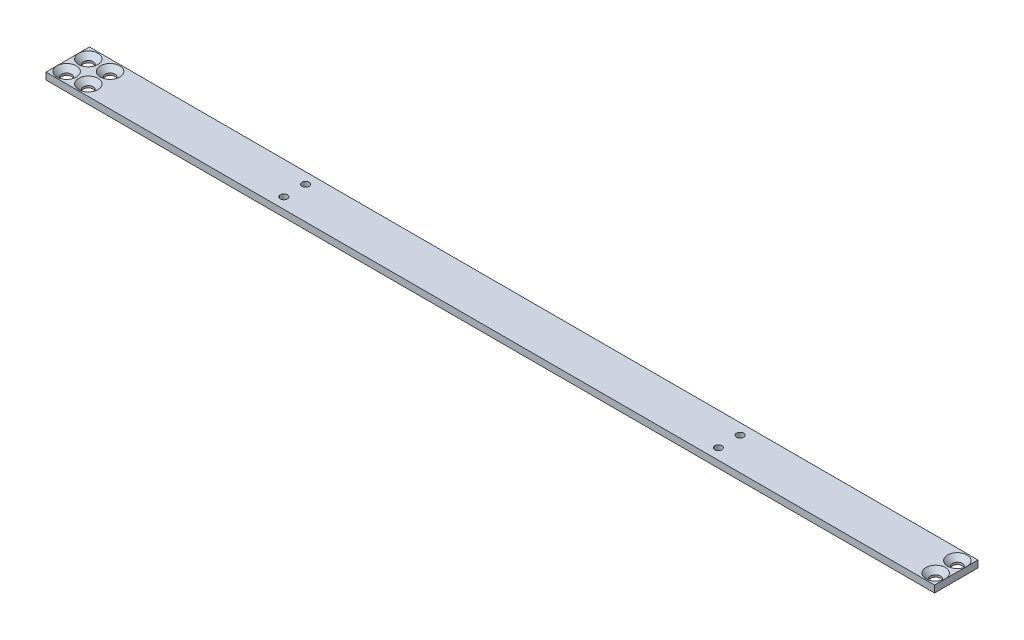
ISO-10303-21;
HEADER;
FILE_DESCRIPTION(('STEP AP214'),'2;1');
FILE_NAME('part.step','',(''),(''),'','','');
FILE_SCHEMA(('AUTOMOTIVE_DESIGN { 1 0 10303 214 1 1 1 1 }'));
ENDSEC;
DATA;
#1=APPLICATION_CONTEXT('core data for automotive mechanical design processes');
#2=APPLICATION_PROTOCOL_DEFINITION('international standard','automotive_design',2000,#1);
#3=PRODUCT_CONTEXT('',#1,'mechanical');
#4=PRODUCT('Part','Part','',(#3));
#5=PRODUCT_RELATED_PRODUCT_CATEGORY('part','',(#4));
#6=PRODUCT_DEFINITION_FORMATION('','',#4);
#7=PRODUCT_DEFINITION_CONTEXT('part definition',#1,'design');
#8=PRODUCT_DEFINITION('design','',#6,#7);
#9=PRODUCT_DEFINITION_SHAPE('','',#8);
#10=(LENGTH_UNIT() NAMED_UNIT(*) SI_UNIT(.MILLI.,.METRE.));
#11=(NAMED_UNIT(*) PLANE_ANGLE_UNIT() SI_UNIT($,.RADIAN.));
#12=(NAMED_UNIT(*) SI_UNIT($,.STERADIAN.) SOLID_ANGLE_UNIT());
#13=UNCERTAINTY_MEASURE_WITH_UNIT(LENGTH_MEASURE(1.E-05),#10,'distance_accuracy_value','');
#14=(GEOMETRIC_REPRESENTATION_CONTEXT(3) GLOBAL_UNCERTAINTY_ASSIGNED_CONTEXT((#13)) GLOBAL_UNIT_ASSIGNED_CONTEXT((#10,
#11,#12)) REPRESENTATION_CONTEXT('',''));
#15=CARTESIAN_POINT('',(0.,0.,0.));
#16=DIRECTION('',(0.,0.,1.));
#17=DIRECTION('',(1.,0.,0.));
#18=AXIS2_PLACEMENT_3D('',#15,#16,#17);
#19=CARTESIAN_POINT('',(0.,0.,0.));
#20=DIRECTION('',(0.,-1.,0.));
#21=DIRECTION('',(0.,0.,-1.));
#22=AXIS2_PLACEMENT_3D('',#19,#20,#21);
#23=PLANE('',#22);
#24=CARTESIAN_POINT('',(100.,0.,-5.00000000000001));
#25=DIRECTION('',(0.,1.,0.));
#26=DIRECTION('',(0.,0.,1.));
#27=AXIS2_PLACEMENT_3D('',#24,#25,#26);
#28=CIRCLE('',#27,1.65);
#29=CARTESIAN_POINT('',(100.,0.,-3.35000000000001));
#30=VERTEX_POINT('',#29);
#31=EDGE_CURVE('E229',#30,#30,#28,.T.);
#32=ORIENTED_EDGE('',*,*,#31,.T.);
#33=EDGE_LOOP('',(#32));
#34=FACE_BOUND('',#33,.T.);
#35=CARTESIAN_POINT('',(-100.,0.,4.99999999999999));
#36=DIRECTION('',(0.,1.,0.));
#37=DIRECTION('',(0.,0.,1.));
#38=AXIS2_PLACEMENT_3D('',#35,#36,#37);
#39=CIRCLE('',#38,1.65);
#40=CARTESIAN_POINT('',(-100.,0.,6.64999999999999));
#41=VERTEX_POINT('',#40);
#42=EDGE_CURVE('E221',#41,#41,#39,.T.);
#43=ORIENTED_EDGE('',*,*,#42,.T.);
#44=EDGE_LOOP('',(#43));
#45=FACE_BOUND('',#44,.T.);
#46=CARTESIAN_POINT('',(-100.,0.,-5.00000000000001));
#47=DIRECTION('',(0.,1.,0.));
#48=DIRECTION('',(0.,0.,1.));
#49=AXIS2_PLACEMENT_3D('',#46,#47,#48);
#50=CIRCLE('',#49,1.65);
#51=CARTESIAN_POINT('',(-100.,0.,-3.35000000000001));
#52=VERTEX_POINT('',#51);
#53=EDGE_CURVE('E213',#52,#52,#50,.T.);
#54=ORIENTED_EDGE('',*,*,#53,.T.);
#55=EDGE_LOOP('',(#54));
#56=FACE_BOUND('',#55,.T.);
#57=CARTESIAN_POINT('',(100.,0.,4.99999999999999));
#58=DIRECTION('',(0.,1.,0.));
#59=DIRECTION('',(0.,0.,1.));
#60=AXIS2_PLACEMENT_3D('',#57,#58,#59);
#61=CIRCLE('',#60,1.65);
#62=CARTESIAN_POINT('',(100.,0.,6.64999999999999));
#63=VERTEX_POINT('',#62);
#64=EDGE_CURVE('E205',#63,#63,#61,.T.);
#65=ORIENTED_EDGE('',*,*,#64,.T.);
#66=EDGE_LOOP('',(#65));
#67=FACE_BOUND('',#66,.T.);
#68=CARTESIAN_POINT('',(-200.,0.,-5.));
#69=DIRECTION('',(0.,1.,0.));
#70=DIRECTION('',(0.,0.,1.));
#71=AXIS2_PLACEMENT_3D('',#68,#69,#70);
#72=CIRCLE('',#71,2.25);
#73=CARTESIAN_POINT('',(-200.,0.,-2.75));
#74=VERTEX_POINT('',#73);
#75=EDGE_CURVE('E169',#74,#74,#72,.T.);
#76=ORIENTED_EDGE('',*,*,#75,.T.);
#77=EDGE_LOOP('',(#76));
#78=FACE_BOUND('',#77,.T.);
#79=CARTESIAN_POINT('',(-190.,0.,5.));
#80=DIRECTION('',(0.,1.,0.));
#81=DIRECTION('',(0.,0.,1.));
#82=AXIS2_PLACEMENT_3D('',#79,#80,#81);
#83=CIRCLE('',#82,2.25);
#84=CARTESIAN_POINT('',(-190.,0.,7.25000000000001));
#85=VERTEX_POINT('',#84);
#86=EDGE_CURVE('E157',#85,#85,#83,.T.);
#87=ORIENTED_EDGE('',*,*,#86,.T.);
#88=EDGE_LOOP('',(#87));
#89=FACE_BOUND('',#88,.T.);
#90=CARTESIAN_POINT('',(200.,0.,-5.));
#91=DIRECTION('',(0.,1.,0.));
#92=DIRECTION('',(0.,0.,1.));
#93=AXIS2_PLACEMENT_3D('',#90,#91,#92);
#94=CIRCLE('',#93,2.25);
#95=CARTESIAN_POINT('',(200.,0.,-2.75));
#96=VERTEX_POINT('',#95);
#97=EDGE_CURVE('E145',#96,#96,#94,.T.);
#98=ORIENTED_EDGE('',*,*,#97,.T.);
#99=EDGE_LOOP('',(#98));
#100=FACE_BOUND('',#99,.T.);
#101=CARTESIAN_POINT('',(200.,0.,5.));
#102=DIRECTION('',(0.,1.,0.));
#103=DIRECTION('',(0.,0.,1.));
#104=AXIS2_PLACEMENT_3D('',#101,#102,#103);
#105=CIRCLE('',#104,2.25);
#106=CARTESIAN_POINT('',(200.,0.,7.25));
#107=VERTEX_POINT('',#106);
#108=EDGE_CURVE('E117',#107,#107,#105,.T.);
#109=ORIENTED_EDGE('',*,*,#108,.T.);
#110=EDGE_LOOP('',(#109));
#111=FACE_BOUND('',#110,.T.);
#112=DIRECTION('',(0.,0.,-1.));
#113=VECTOR('',#112,1.);
#114=CARTESIAN_POINT('',(204.5,0.,9.99999999999999));
#115=LINE('',#114,#113);
#116=CARTESIAN_POINT('',(204.5,0.,9.99999999999999));
#117=VERTEX_POINT('',#116);
#118=CARTESIAN_POINT('',(204.5,0.,-10.));
#119=VERTEX_POINT('',#118);
#120=EDGE_CURVE('E113',#117,#119,#115,.T.);
#121=ORIENTED_EDGE('',*,*,#120,.F.);
#122=DIRECTION('',(1.,0.,0.));
#123=VECTOR('',#122,1.);
#124=CARTESIAN_POINT('',(-204.5,0.,9.99999999999999));
#125=LINE('',#124,#123);
#126=CARTESIAN_POINT('',(-204.5,0.,9.99999999999999));
#127=VERTEX_POINT('',#126);
#128=EDGE_CURVE('E84',#127,#117,#125,.T.);
#129=ORIENTED_EDGE('',*,*,#128,.F.);
#130=DIRECTION('',(0.,0.,1.));
#131=VECTOR('',#130,1.);
#132=CARTESIAN_POINT('',(-204.5,0.,9.99999999999999));
#133=LINE('',#132,#131);
#134=CARTESIAN_POINT('',(-204.5,0.,-10.));
#135=VERTEX_POINT('',#134);
#136=EDGE_CURVE('E78',#135,#127,#133,.T.);
#137=ORIENTED_EDGE('',*,*,#136,.F.);
#138=DIRECTION('',(-1.,0.,0.));
#139=VECTOR('',#138,1.);
#140=CARTESIAN_POINT('',(-204.5,0.,-10.));
#141=LINE('',#140,#139);
#142=EDGE_CURVE('E102',#119,#135,#141,.T.);
#143=ORIENTED_EDGE('',*,*,#142,.F.);
#144=EDGE_LOOP('',(#121,#129,#137,#143));
#145=FACE_BOUND('',#144,.T.);
#146=CARTESIAN_POINT('',(-200.,0.,5.));
#147=DIRECTION('',(0.,1.,0.));
#148=DIRECTION('',(0.,0.,1.));
#149=AXIS2_PLACEMENT_3D('',#146,#147,#148);
#150=CIRCLE('',#149,2.25);
#151=CARTESIAN_POINT('',(-200.,0.,7.25000000000001));
#152=VERTEX_POINT('',#151);
#153=EDGE_CURVE('E181',#152,#152,#150,.T.);
#154=ORIENTED_EDGE('',*,*,#153,.T.);
#155=EDGE_LOOP('',(#154));
#156=FACE_BOUND('',#155,.T.);
#157=CARTESIAN_POINT('',(-190.,0.,-5.));
#158=DIRECTION('',(0.,1.,0.));
#159=DIRECTION('',(0.,0.,1.));
#160=AXIS2_PLACEMENT_3D('',#157,#158,#159);
#161=CIRCLE('',#160,2.25);
#162=CARTESIAN_POINT('',(-190.,0.,-2.75));
#163=VERTEX_POINT('',#162);
#164=EDGE_CURVE('E193',#163,#163,#161,.T.);
#165=ORIENTED_EDGE('',*,*,#164,.T.);
#166=EDGE_LOOP('',(#165));
#167=FACE_BOUND('',#166,.T.);
#168=ADVANCED_FACE('F43',(#34,#45,#56,#67,#78,#89,#100,#111,#145,#156,#167),#23,.T.);
#169=CARTESIAN_POINT('',(0.,3.175,0.));
#170=DIRECTION('',(0.,-1.,0.));
#171=DIRECTION('',(0.,0.,-1.));
#172=AXIS2_PLACEMENT_3D('',#169,#170,#171);
#173=PLANE('',#172);
#174=CARTESIAN_POINT('',(100.,3.175,-5.00000000000001));
#175=DIRECTION('',(0.,1.,0.));
#176=DIRECTION('',(0.,0.,1.));
#177=AXIS2_PLACEMENT_3D('',#174,#175,#176);
#178=CIRCLE('',#177,1.65);
#179=CARTESIAN_POINT('',(100.,3.175,-3.35000000000001));
#180=VERTEX_POINT('',#179);
#181=EDGE_CURVE('E233',#180,#180,#178,.T.);
#182=ORIENTED_EDGE('',*,*,#181,.F.);
#183=EDGE_LOOP('',(#182));
#184=FACE_BOUND('',#183,.T.);
#185=CARTESIAN_POINT('',(-100.,3.175,4.99999999999999));
#186=DIRECTION('',(0.,1.,0.));
#187=DIRECTION('',(0.,0.,1.));
#188=AXIS2_PLACEMENT_3D('',#185,#186,#187);
#189=CIRCLE('',#188,1.65);
#190=CARTESIAN_POINT('',(-100.,3.175,6.64999999999999));
#191=VERTEX_POINT('',#190);
#192=EDGE_CURVE('E225',#191,#191,#189,.T.);
#193=ORIENTED_EDGE('',*,*,#192,.F.);
#194=EDGE_LOOP('',(#193));
#195=FACE_BOUND('',#194,.T.);
#196=CARTESIAN_POINT('',(-100.,3.175,-5.00000000000001));
#197=DIRECTION('',(0.,1.,0.));
#198=DIRECTION('',(0.,0.,1.));
#199=AXIS2_PLACEMENT_3D('',#196,#197,#198);
#200=CIRCLE('',#199,1.65);
#201=CARTESIAN_POINT('',(-100.,3.175,-3.35000000000001));
#202=VERTEX_POINT('',#201);
#203=EDGE_CURVE('E217',#202,#202,#200,.T.);
#204=ORIENTED_EDGE('',*,*,#203,.F.);
#205=EDGE_LOOP('',(#204));
#206=FACE_BOUND('',#205,.T.);
#207=CARTESIAN_POINT('',(100.,3.175,4.99999999999999));
#208=DIRECTION('',(0.,1.,0.));
#209=DIRECTION('',(0.,0.,1.));
#210=AXIS2_PLACEMENT_3D('',#207,#208,#209);
#211=CIRCLE('',#210,1.65);
#212=CARTESIAN_POINT('',(100.,3.175,6.64999999999999));
#213=VERTEX_POINT('',#212);
#214=EDGE_CURVE('E209',#213,#213,#211,.T.);
#215=ORIENTED_EDGE('',*,*,#214,.F.);
#216=EDGE_LOOP('',(#215));
#217=FACE_BOUND('',#216,.T.);
#218=CARTESIAN_POINT('',(-190.,3.175,-5.));
#219=DIRECTION('',(0.,1.,0.));
#220=DIRECTION('',(0.,0.,1.));
#221=AXIS2_PLACEMENT_3D('',#218,#219,#220);
#222=CIRCLE('',#221,4.48000000000001);
#223=CARTESIAN_POINT('',(-190.,3.175,-0.519999999999993));
#224=VERTEX_POINT('',#223);
#225=EDGE_CURVE('E201',#224,#224,#222,.T.);
#226=ORIENTED_EDGE('',*,*,#225,.F.);
#227=EDGE_LOOP('',(#226));
#228=FACE_BOUND('',#227,.T.);
#229=CARTESIAN_POINT('',(-200.,3.175,5.));
#230=DIRECTION('',(0.,1.,0.));
#231=DIRECTION('',(0.,0.,1.));
#232=AXIS2_PLACEMENT_3D('',#229,#230,#231);
#233=CIRCLE('',#232,4.48000000000001);
#234=CARTESIAN_POINT('',(-200.,3.175,9.48000000000002));
#235=VERTEX_POINT('',#234);
#236=EDGE_CURVE('E189',#235,#235,#233,.T.);
#237=ORIENTED_EDGE('',*,*,#236,.F.);
#238=EDGE_LOOP('',(#237));
#239=FACE_BOUND('',#238,.T.);
#240=CARTESIAN_POINT('',(-200.,3.175,-5.));
#241=DIRECTION('',(0.,1.,0.));
#242=DIRECTION('',(0.,0.,1.));
#243=AXIS2_PLACEMENT_3D('',#240,#241,#242);
#244=CIRCLE('',#243,4.48000000000001);
#245=CARTESIAN_POINT('',(-200.,3.175,-0.519999999999993));
#246=VERTEX_POINT('',#245);
#247=EDGE_CURVE('E177',#246,#246,#244,.T.);
#248=ORIENTED_EDGE('',*,*,#247,.F.);
#249=EDGE_LOOP('',(#248));
#250=FACE_BOUND('',#249,.T.);
#251=CARTESIAN_POINT('',(-190.,3.175,5.));
#252=DIRECTION('',(0.,1.,0.));
#253=DIRECTION('',(0.,0.,1.));
#254=AXIS2_PLACEMENT_3D('',#251,#252,#253);
#255=CIRCLE('',#254,4.48000000000001);
#256=CARTESIAN_POINT('',(-190.,3.175,9.48000000000002));
#257=VERTEX_POINT('',#256);
#258=EDGE_CURVE('E165',#257,#257,#255,.T.);
#259=ORIENTED_EDGE('',*,*,#258,.F.);
#260=EDGE_LOOP('',(#259));
#261=FACE_BOUND('',#260,.T.);
#262=CARTESIAN_POINT('',(200.,3.175,5.));
#263=DIRECTION('',(0.,1.,0.));
#264=DIRECTION('',(0.,0.,1.));
#265=AXIS2_PLACEMENT_3D('',#262,#263,#264);
#266=CIRCLE('',#265,4.48000000000001);
#267=CARTESIAN_POINT('',(200.,3.175,9.48000000000001));
#268=VERTEX_POINT('',#267);
#269=EDGE_CURVE('E141',#268,#268,#266,.T.);
#270=ORIENTED_EDGE('',*,*,#269,.F.);
#271=EDGE_LOOP('',(#270));
#272=FACE_BOUND('',#271,.T.);
#273=DIRECTION('',(0.,0.,-1.));
#274=VECTOR('',#273,1.);
#275=CARTESIAN_POINT('',(204.5,3.175,9.99999999999999));
#276=LINE('',#275,#274);
#277=CARTESIAN_POINT('',(204.5,3.175,9.99999999999999));
#278=VERTEX_POINT('',#277);
#279=CARTESIAN_POINT('',(204.5,3.175,-10.));
#280=VERTEX_POINT('',#279);
#281=EDGE_CURVE('E97',#278,#280,#276,.T.);
#282=ORIENTED_EDGE('',*,*,#281,.T.);
#283=DIRECTION('',(-1.,0.,0.));
#284=VECTOR('',#283,1.);
#285=CARTESIAN_POINT('',(-204.5,3.175,-10.));
#286=LINE('',#285,#284);
#287=CARTESIAN_POINT('',(-204.5,3.175,-10.));
#288=VERTEX_POINT('',#287);
#289=EDGE_CURVE('E91',#280,#288,#286,.T.);
#290=ORIENTED_EDGE('',*,*,#289,.T.);
#291=DIRECTION('',(0.,0.,1.));
#292=VECTOR('',#291,1.);
#293=CARTESIAN_POINT('',(-204.5,3.175,9.99999999999999));
#294=LINE('',#293,#292);
#295=CARTESIAN_POINT('',(-204.5,3.175,9.99999999999999));
#296=VERTEX_POINT('',#295);
#297=EDGE_CURVE('E95',#288,#296,#294,.T.);
#298=ORIENTED_EDGE('',*,*,#297,.T.);
#299=DIRECTION('',(1.,0.,0.));
#300=VECTOR('',#299,1.);
#301=CARTESIAN_POINT('',(-204.5,3.175,9.99999999999999));
#302=LINE('',#301,#300);
#303=EDGE_CURVE('E61',#296,#278,#302,.T.);
#304=ORIENTED_EDGE('',*,*,#303,.T.);
#305=EDGE_LOOP('',(#282,#290,#298,#304));
#306=FACE_BOUND('',#305,.T.);
#307=CARTESIAN_POINT('',(200.,3.175,-5.));
#308=DIRECTION('',(0.,1.,0.));
#309=DIRECTION('',(0.,0.,1.));
#310=AXIS2_PLACEMENT_3D('',#307,#308,#309);
#311=CIRCLE('',#310,4.48000000000001);
#312=CARTESIAN_POINT('',(200.,3.175,-0.519999999999988));
#313=VERTEX_POINT('',#312);
#314=EDGE_CURVE('E153',#313,#313,#311,.T.);
#315=ORIENTED_EDGE('',*,*,#314,.F.);
#316=EDGE_LOOP('',(#315));
#317=FACE_BOUND('',#316,.T.);
#318=ADVANCED_FACE('F92',(#184,#195,#206,#217,#228,#239,#250,#261,#272,#306,#317),#173,.F.);
#319=CARTESIAN_POINT('',(204.5,3.175,9.99999999999999));
#320=DIRECTION('',(-1.,0.,0.));
#321=DIRECTION('',(0.,0.,1.));
#322=AXIS2_PLACEMENT_3D('',#319,#320,#321);
#323=PLANE('',#322);
#324=ORIENTED_EDGE('',*,*,#120,.T.);
#325=DIRECTION('',(0.,-1.,0.));
#326=VECTOR('',#325,1.);
#327=CARTESIAN_POINT('',(204.5,3.175,-10.));
#328=LINE('',#327,#326);
#329=EDGE_CURVE('E11',#280,#119,#328,.T.);
#330=ORIENTED_EDGE('',*,*,#329,.F.);
#331=ORIENTED_EDGE('',*,*,#281,.F.);
#332=DIRECTION('',(0.,-1.,0.));
#333=VECTOR('',#332,1.);
#334=CARTESIAN_POINT('',(204.5,3.175,9.99999999999999));
#335=LINE('',#334,#333);
#336=EDGE_CURVE('E109',#278,#117,#335,.T.);
#337=ORIENTED_EDGE('',*,*,#336,.T.);
#338=EDGE_LOOP('',(#324,#330,#331,#337));
#339=FACE_BOUND('',#338,.T.);
#340=ADVANCED_FACE('F45',(#339),#323,.F.);
#341=CARTESIAN_POINT('',(-204.5,3.175,-10.));
#342=DIRECTION('',(0.,0.,1.));
#343=DIRECTION('',(1.,0.,0.));
#344=AXIS2_PLACEMENT_3D('',#341,#342,#343);
#345=PLANE('',#344);
#346=ORIENTED_EDGE('',*,*,#142,.T.);
#347=DIRECTION('',(0.,-1.,0.));
#348=VECTOR('',#347,1.);
#349=CARTESIAN_POINT('',(-204.5,3.175,-10.));
#350=LINE('',#349,#348);
#351=EDGE_CURVE('E53',#288,#135,#350,.T.);
#352=ORIENTED_EDGE('',*,*,#351,.F.);
#353=ORIENTED_EDGE('',*,*,#289,.F.);
#354=ORIENTED_EDGE('',*,*,#329,.T.);
#355=EDGE_LOOP('',(#346,#352,#353,#354));
#356=FACE_BOUND('',#355,.T.);
#357=ADVANCED_FACE('F101',(#356),#345,.F.);
#358=CARTESIAN_POINT('',(-204.5,3.175,9.99999999999999));
#359=DIRECTION('',(1.,0.,0.));
#360=DIRECTION('',(0.,0.,-1.));
#361=AXIS2_PLACEMENT_3D('',#358,#359,#360);
#362=PLANE('',#361);
#363=ORIENTED_EDGE('',*,*,#136,.T.);
#364=DIRECTION('',(0.,-1.,0.));
#365=VECTOR('',#364,1.);
#366=CARTESIAN_POINT('',(-204.5,3.175,9.99999999999999));
#367=LINE('',#366,#365);
#368=EDGE_CURVE('E104',#296,#127,#367,.T.);
#369=ORIENTED_EDGE('',*,*,#368,.F.);
#370=ORIENTED_EDGE('',*,*,#297,.F.);
#371=ORIENTED_EDGE('',*,*,#351,.T.);
#372=EDGE_LOOP('',(#363,#369,#370,#371));
#373=FACE_BOUND('',#372,.T.);
#374=ADVANCED_FACE('F105',(#373),#362,.F.);
#375=CARTESIAN_POINT('',(-204.5,3.175,9.99999999999999));
#376=DIRECTION('',(0.,0.,-1.));
#377=DIRECTION('',(-1.,0.,0.));
#378=AXIS2_PLACEMENT_3D('',#375,#376,#377);
#379=PLANE('',#378);
#380=ORIENTED_EDGE('',*,*,#128,.T.);
#381=ORIENTED_EDGE('',*,*,#336,.F.);
#382=ORIENTED_EDGE('',*,*,#303,.F.);
#383=ORIENTED_EDGE('',*,*,#368,.T.);
#384=EDGE_LOOP('',(#380,#381,#382,#383));
#385=FACE_BOUND('',#384,.T.);
#386=ADVANCED_FACE('F127',(#385),#379,.F.);
#387=CARTESIAN_POINT('',(200.,3.175,5.));
#388=DIRECTION('',(0.,1.,0.));
#389=DIRECTION('',(0.,0.,1.));
#390=AXIS2_PLACEMENT_3D('',#387,#388,#389);
#391=CYLINDRICAL_SURFACE('',#390,2.25);
#392=ORIENTED_EDGE('',*,*,#108,.F.);
#393=EDGE_LOOP('',(#392));
#394=FACE_BOUND('',#393,.T.);
#395=CARTESIAN_POINT('',(200.,0.944999999999999,5.));
#396=DIRECTION('',(0.,1.,0.));
#397=DIRECTION('',(0.,0.,1.));
#398=AXIS2_PLACEMENT_3D('',#395,#396,#397);
#399=CIRCLE('',#398,2.25);
#400=CARTESIAN_POINT('',(200.,0.944999999999999,7.25));
#401=VERTEX_POINT('',#400);
#402=EDGE_CURVE('E137',#401,#401,#399,.T.);
#403=ORIENTED_EDGE('',*,*,#402,.T.);
#404=EDGE_LOOP('',(#403));
#405=FACE_BOUND('',#404,.T.);
#406=ADVANCED_FACE('F262',(#394,#405),#391,.F.);
#407=CARTESIAN_POINT('',(200.,3.175,5.));
#408=DIRECTION('',(0.,1.,0.));
#409=DIRECTION('',(0.,0.,1.));
#410=AXIS2_PLACEMENT_3D('',#407,#408,#409);
#411=CONICAL_SURFACE('',#410,4.48000000000001,0.78539816339745);
#412=ORIENTED_EDGE('',*,*,#402,.F.);
#413=EDGE_LOOP('',(#412));
#414=FACE_BOUND('',#413,.T.);
#415=ORIENTED_EDGE('',*,*,#269,.T.);
#416=EDGE_LOOP('',(#415));
#417=FACE_BOUND('',#416,.T.);
#418=ADVANCED_FACE('F259',(#414,#417),#411,.F.);
#419=CARTESIAN_POINT('',(200.,3.175,-5.));
#420=DIRECTION('',(0.,1.,0.));
#421=DIRECTION('',(0.,0.,1.));
#422=AXIS2_PLACEMENT_3D('',#419,#420,#421);
#423=CYLINDRICAL_SURFACE('',#422,2.25);
#424=ORIENTED_EDGE('',*,*,#97,.F.);
#425=EDGE_LOOP('',(#424));
#426=FACE_BOUND('',#425,.T.);
#427=CARTESIAN_POINT('',(200.,0.944999999999999,-5.));
#428=DIRECTION('',(0.,1.,0.));
#429=DIRECTION('',(0.,0.,1.));
#430=AXIS2_PLACEMENT_3D('',#427,#428,#429);
#431=CIRCLE('',#430,2.25);
#432=CARTESIAN_POINT('',(200.,0.944999999999999,-2.75));
#433=VERTEX_POINT('',#432);
#434=EDGE_CURVE('E149',#433,#433,#431,.T.);
#435=ORIENTED_EDGE('',*,*,#434,.T.);
#436=EDGE_LOOP('',(#435));
#437=FACE_BOUND('',#436,.T.);
#438=ADVANCED_FACE('F261',(#426,#437),#423,.F.);
#439=CARTESIAN_POINT('',(200.,3.175,-5.));
#440=DIRECTION('',(0.,1.,0.));
#441=DIRECTION('',(0.,0.,1.));
#442=AXIS2_PLACEMENT_3D('',#439,#440,#441);
#443=CONICAL_SURFACE('',#442,4.48000000000001,0.78539816339745);
#444=ORIENTED_EDGE('',*,*,#434,.F.);
#445=EDGE_LOOP('',(#444));
#446=FACE_BOUND('',#445,.T.);
#447=ORIENTED_EDGE('',*,*,#314,.T.);
#448=EDGE_LOOP('',(#447));
#449=FACE_BOUND('',#448,.T.);
#450=ADVANCED_FACE('F269',(#446,#449),#443,.F.);
#451=CARTESIAN_POINT('',(-190.,3.175,5.));
#452=DIRECTION('',(0.,1.,0.));
#453=DIRECTION('',(0.,0.,1.));
#454=AXIS2_PLACEMENT_3D('',#451,#452,#453);
#455=CYLINDRICAL_SURFACE('',#454,2.25);
#456=ORIENTED_EDGE('',*,*,#86,.F.);
#457=EDGE_LOOP('',(#456));
#458=FACE_BOUND('',#457,.T.);
#459=CARTESIAN_POINT('',(-190.,0.944999999999999,5.));
#460=DIRECTION('',(0.,1.,0.));
#461=DIRECTION('',(0.,0.,1.));
#462=AXIS2_PLACEMENT_3D('',#459,#460,#461);
#463=CIRCLE('',#462,2.25);
#464=CARTESIAN_POINT('',(-190.,0.944999999999999,7.25000000000001));
#465=VERTEX_POINT('',#464);
#466=EDGE_CURVE('E161',#465,#465,#463,.T.);
#467=ORIENTED_EDGE('',*,*,#466,.T.);
#468=EDGE_LOOP('',(#467));
#469=FACE_BOUND('',#468,.T.);
#470=ADVANCED_FACE('F386',(#458,#469),#455,.F.);
#471=CARTESIAN_POINT('',(-190.,3.175,5.));
#472=DIRECTION('',(0.,1.,0.));
#473=DIRECTION('',(0.,0.,1.));
#474=AXIS2_PLACEMENT_3D('',#471,#472,#473);
#475=CONICAL_SURFACE('',#474,4.48000000000001,0.78539816339745);
#476=ORIENTED_EDGE('',*,*,#466,.F.);
#477=EDGE_LOOP('',(#476));
#478=FACE_BOUND('',#477,.T.);
#479=ORIENTED_EDGE('',*,*,#258,.T.);
#480=EDGE_LOOP('',(#479));
#481=FACE_BOUND('',#480,.T.);
#482=ADVANCED_FACE('F378',(#478,#481),#475,.F.);
#483=CARTESIAN_POINT('',(-200.,3.175,-5.));
#484=DIRECTION('',(0.,1.,0.));
#485=DIRECTION('',(0.,0.,1.));
#486=AXIS2_PLACEMENT_3D('',#483,#484,#485);
#487=CYLINDRICAL_SURFACE('',#486,2.25);
#488=ORIENTED_EDGE('',*,*,#75,.F.);
#489=EDGE_LOOP('',(#488));
#490=FACE_BOUND('',#489,.T.);
#491=CARTESIAN_POINT('',(-200.,0.944999999999999,-5.));
#492=DIRECTION('',(0.,1.,0.));
#493=DIRECTION('',(0.,0.,1.));
#494=AXIS2_PLACEMENT_3D('',#491,#492,#493);
#495=CIRCLE('',#494,2.25);
#496=CARTESIAN_POINT('',(-200.,0.944999999999999,-2.75));
#497=VERTEX_POINT('',#496);
#498=EDGE_CURVE('E173',#497,#497,#495,.T.);
#499=ORIENTED_EDGE('',*,*,#498,.T.);
#500=EDGE_LOOP('',(#499));
#501=FACE_BOUND('',#500,.T.);
#502=ADVANCED_FACE('F370',(#490,#501),#487,.F.);
#503=CARTESIAN_POINT('',(-200.,3.175,-5.));
#504=DIRECTION('',(0.,1.,0.));
#505=DIRECTION('',(0.,0.,1.));
#506=AXIS2_PLACEMENT_3D('',#503,#504,#505);
#507=CONICAL_SURFACE('',#506,4.48000000000001,0.78539816339745);
#508=ORIENTED_EDGE('',*,*,#498,.F.);
#509=EDGE_LOOP('',(#508));
#510=FACE_BOUND('',#509,.T.);
#511=ORIENTED_EDGE('',*,*,#247,.T.);
#512=EDGE_LOOP('',(#511));
#513=FACE_BOUND('',#512,.T.);
#514=ADVANCED_FACE('F362',(#510,#513),#507,.F.);
#515=CARTESIAN_POINT('',(-200.,3.175,5.));
#516=DIRECTION('',(0.,1.,0.));
#517=DIRECTION('',(0.,0.,1.));
#518=AXIS2_PLACEMENT_3D('',#515,#516,#517);
#519=CYLINDRICAL_SURFACE('',#518,2.25);
#520=ORIENTED_EDGE('',*,*,#153,.F.);
#521=EDGE_LOOP('',(#520));
#522=FACE_BOUND('',#521,.T.);
#523=CARTESIAN_POINT('',(-200.,0.944999999999999,5.));
#524=DIRECTION('',(0.,1.,0.));
#525=DIRECTION('',(0.,0.,1.));
#526=AXIS2_PLACEMENT_3D('',#523,#524,#525);
#527=CIRCLE('',#526,2.25);
#528=CARTESIAN_POINT('',(-200.,0.944999999999999,7.25000000000001));
#529=VERTEX_POINT('',#528);
#530=EDGE_CURVE('E185',#529,#529,#527,.T.);
#531=ORIENTED_EDGE('',*,*,#530,.T.);
#532=EDGE_LOOP('',(#531));
#533=FACE_BOUND('',#532,.T.);
#534=ADVANCED_FACE('F354',(#522,#533),#519,.F.);
#535=CARTESIAN_POINT('',(-200.,3.175,5.));
#536=DIRECTION('',(0.,1.,0.));
#537=DIRECTION('',(0.,0.,1.));
#538=AXIS2_PLACEMENT_3D('',#535,#536,#537);
#539=CONICAL_SURFACE('',#538,4.48000000000001,0.78539816339745);
#540=ORIENTED_EDGE('',*,*,#530,.F.);
#541=EDGE_LOOP('',(#540));
#542=FACE_BOUND('',#541,.T.);
#543=ORIENTED_EDGE('',*,*,#236,.T.);
#544=EDGE_LOOP('',(#543));
#545=FACE_BOUND('',#544,.T.);
#546=ADVANCED_FACE('F346',(#542,#545),#539,.F.);
#547=CARTESIAN_POINT('',(-190.,3.175,-5.));
#548=DIRECTION('',(0.,1.,0.));
#549=DIRECTION('',(0.,0.,1.));
#550=AXIS2_PLACEMENT_3D('',#547,#548,#549);
#551=CYLINDRICAL_SURFACE('',#550,2.25);
#552=ORIENTED_EDGE('',*,*,#164,.F.);
#553=EDGE_LOOP('',(#552));
#554=FACE_BOUND('',#553,.T.);
#555=CARTESIAN_POINT('',(-190.,0.944999999999999,-5.));
#556=DIRECTION('',(0.,1.,0.));
#557=DIRECTION('',(0.,0.,1.));
#558=AXIS2_PLACEMENT_3D('',#555,#556,#557);
#559=CIRCLE('',#558,2.25);
#560=CARTESIAN_POINT('',(-190.,0.944999999999999,-2.75));
#561=VERTEX_POINT('',#560);
#562=EDGE_CURVE('E197',#561,#561,#559,.T.);
#563=ORIENTED_EDGE('',*,*,#562,.T.);
#564=EDGE_LOOP('',(#563));
#565=FACE_BOUND('',#564,.T.);
#566=ADVANCED_FACE('F338',(#554,#565),#551,.F.);
#567=CARTESIAN_POINT('',(-190.,3.175,-5.));
#568=DIRECTION('',(0.,1.,0.));
#569=DIRECTION('',(0.,0.,1.));
#570=AXIS2_PLACEMENT_3D('',#567,#568,#569);
#571=CONICAL_SURFACE('',#570,4.48000000000001,0.78539816339745);
#572=ORIENTED_EDGE('',*,*,#562,.F.);
#573=EDGE_LOOP('',(#572));
#574=FACE_BOUND('',#573,.T.);
#575=ORIENTED_EDGE('',*,*,#225,.T.);
#576=EDGE_LOOP('',(#575));
#577=FACE_BOUND('',#576,.T.);
#578=ADVANCED_FACE('F330',(#574,#577),#571,.F.);
#579=CARTESIAN_POINT('',(100.,3.175,4.99999999999999));
#580=DIRECTION('',(0.,1.,0.));
#581=DIRECTION('',(0.,0.,1.));
#582=AXIS2_PLACEMENT_3D('',#579,#580,#581);
#583=CYLINDRICAL_SURFACE('',#582,1.65);
#584=ORIENTED_EDGE('',*,*,#64,.F.);
#585=EDGE_LOOP('',(#584));
#586=FACE_BOUND('',#585,.T.);
#587=ORIENTED_EDGE('',*,*,#214,.T.);
#588=EDGE_LOOP('',(#587));
#589=FACE_BOUND('',#588,.T.);
#590=ADVANCED_FACE('F321',(#586,#589),#583,.F.);
#591=CARTESIAN_POINT('',(-100.,3.175,-5.00000000000001));
#592=DIRECTION('',(0.,1.,0.));
#593=DIRECTION('',(0.,0.,1.));
#594=AXIS2_PLACEMENT_3D('',#591,#592,#593);
#595=CYLINDRICAL_SURFACE('',#594,1.65);
#596=ORIENTED_EDGE('',*,*,#53,.F.);
#597=EDGE_LOOP('',(#596));
#598=FACE_BOUND('',#597,.T.);
#599=ORIENTED_EDGE('',*,*,#203,.T.);
#600=EDGE_LOOP('',(#599));
#601=FACE_BOUND('',#600,.T.);
#602=ADVANCED_FACE('F314',(#598,#601),#595,.F.);
#603=CARTESIAN_POINT('',(-100.,3.175,4.99999999999999));
#604=DIRECTION('',(0.,1.,0.));
#605=DIRECTION('',(0.,0.,1.));
#606=AXIS2_PLACEMENT_3D('',#603,#604,#605);
#607=CYLINDRICAL_SURFACE('',#606,1.65);
#608=ORIENTED_EDGE('',*,*,#42,.F.);
#609=EDGE_LOOP('',(#608));
#610=FACE_BOUND('',#609,.T.);
#611=ORIENTED_EDGE('',*,*,#192,.T.);
#612=EDGE_LOOP('',(#611));
#613=FACE_BOUND('',#612,.T.);
#614=ADVANCED_FACE('F304',(#610,#613),#607,.F.);
#615=CARTESIAN_POINT('',(100.,3.175,-5.00000000000001));
#616=DIRECTION('',(0.,1.,0.));
#617=DIRECTION('',(0.,0.,1.));
#618=AXIS2_PLACEMENT_3D('',#615,#616,#617);
#619=CYLINDRICAL_SURFACE('',#618,1.65);
#620=ORIENTED_EDGE('',*,*,#31,.F.);
#621=EDGE_LOOP('',(#620));
#622=FACE_BOUND('',#621,.T.);
#623=ORIENTED_EDGE('',*,*,#181,.T.);
#624=EDGE_LOOP('',(#623));
#625=FACE_BOUND('',#624,.T.);
#626=ADVANCED_FACE('F238',(#622,#625),#619,.F.);
#627=CLOSED_SHELL('',(#168,#318,#340,#357,#374,#386,#406,#418,#438,#450,#470,#482,#502,#514,
#534,#546,#566,#578,#590,#602,#614,#626));
#628=MANIFOLD_SOLID_BREP('B2',#627);
#629=ADVANCED_BREP_SHAPE_REPRESENTATION('',(#18,#628),#14);
#630=SHAPE_DEFINITION_REPRESENTATION(#9,#629);
ENDSEC;
END-ISO-10303-21;
